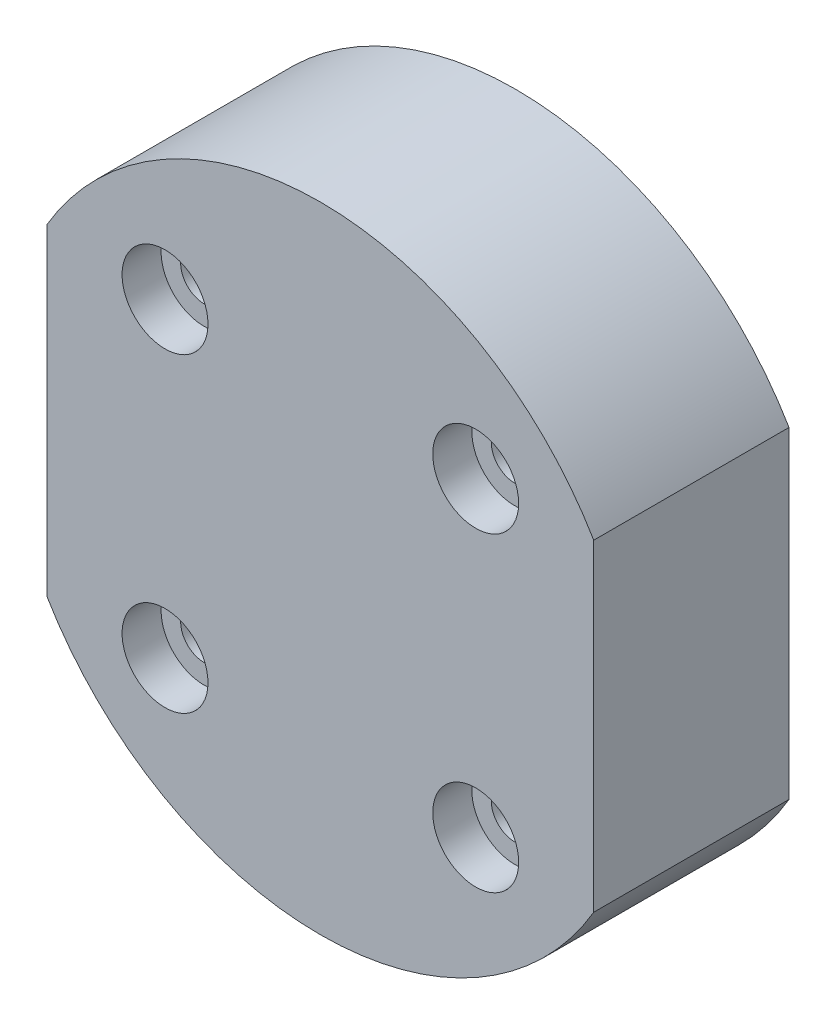
ISO-10303-21;
HEADER;
FILE_DESCRIPTION(('STEP AP214'),'2;1');
FILE_NAME('part.step','',(''),(''),'','','');
FILE_SCHEMA(('AUTOMOTIVE_DESIGN { 1 0 10303 214 1 1 1 1 }'));
ENDSEC;
DATA;
#1=APPLICATION_CONTEXT('core data for automotive mechanical design processes');
#2=APPLICATION_PROTOCOL_DEFINITION('international standard','automotive_design',2000,#1);
#3=PRODUCT_CONTEXT('',#1,'mechanical');
#4=PRODUCT('Part','Part','',(#3));
#5=PRODUCT_RELATED_PRODUCT_CATEGORY('part','',(#4));
#6=PRODUCT_DEFINITION_FORMATION('','',#4);
#7=PRODUCT_DEFINITION_CONTEXT('part definition',#1,'design');
#8=PRODUCT_DEFINITION('design','',#6,#7);
#9=PRODUCT_DEFINITION_SHAPE('','',#8);
#10=(LENGTH_UNIT() NAMED_UNIT(*) SI_UNIT(.MILLI.,.METRE.));
#11=(NAMED_UNIT(*) PLANE_ANGLE_UNIT() SI_UNIT($,.RADIAN.));
#12=(NAMED_UNIT(*) SI_UNIT($,.STERADIAN.) SOLID_ANGLE_UNIT());
#13=UNCERTAINTY_MEASURE_WITH_UNIT(LENGTH_MEASURE(1.E-05),#10,'distance_accuracy_value','');
#14=(GEOMETRIC_REPRESENTATION_CONTEXT(3) GLOBAL_UNCERTAINTY_ASSIGNED_CONTEXT((#13)) GLOBAL_UNIT_ASSIGNED_CONTEXT((#10,
#11,#12)) REPRESENTATION_CONTEXT('',''));
#15=CARTESIAN_POINT('',(0.,0.,0.));
#16=DIRECTION('',(0.,0.,1.));
#17=DIRECTION('',(1.,0.,0.));
#18=AXIS2_PLACEMENT_3D('',#15,#16,#17);
#19=CARTESIAN_POINT('',(0.,0.,-10.));
#20=DIRECTION('',(0.,0.,1.));
#21=DIRECTION('',(1.,0.,0.));
#22=AXIS2_PLACEMENT_3D('',#19,#20,#21);
#23=CYLINDRICAL_SURFACE('',#22,16.25);
#24=DIRECTION('',(0.,0.,1.));
#25=VECTOR('',#24,1.);
#26=CARTESIAN_POINT('',(14.,-8.25,-10.));
#27=LINE('',#26,#25);
#28=CARTESIAN_POINT('',(14.,-8.25,-10.));
#29=VERTEX_POINT('',#28);
#30=CARTESIAN_POINT('',(14.,-8.25,0.));
#31=VERTEX_POINT('',#30);
#32=EDGE_CURVE('E78',#29,#31,#27,.T.);
#33=ORIENTED_EDGE('',*,*,#32,.T.);
#34=CARTESIAN_POINT('',(0.,0.,0.));
#35=DIRECTION('',(0.,0.,1.));
#36=DIRECTION('',(1.,0.,0.));
#37=AXIS2_PLACEMENT_3D('',#34,#35,#36);
#38=CIRCLE('',#37,16.25);
#39=CARTESIAN_POINT('',(-14.,-8.25,0.));
#40=VERTEX_POINT('',#39);
#41=EDGE_CURVE('E100',#40,#31,#38,.T.);
#42=ORIENTED_EDGE('',*,*,#41,.F.);
#43=DIRECTION('',(0.,0.,1.));
#44=VECTOR('',#43,1.);
#45=CARTESIAN_POINT('',(-14.,-8.25,-10.));
#46=LINE('',#45,#44);
#47=CARTESIAN_POINT('',(-14.,-8.25,-10.));
#48=VERTEX_POINT('',#47);
#49=EDGE_CURVE('E52',#48,#40,#46,.T.);
#50=ORIENTED_EDGE('',*,*,#49,.F.);
#51=CARTESIAN_POINT('',(0.,0.,-10.));
#52=DIRECTION('',(0.,0.,1.));
#53=DIRECTION('',(1.,0.,0.));
#54=AXIS2_PLACEMENT_3D('',#51,#52,#53);
#55=CIRCLE('',#54,16.25);
#56=EDGE_CURVE('E95',#48,#29,#55,.T.);
#57=ORIENTED_EDGE('',*,*,#56,.T.);
#58=EDGE_LOOP('',(#33,#42,#50,#57));
#59=FACE_BOUND('',#58,.T.);
#60=ADVANCED_FACE('F37',(#59),#23,.T.);
#61=DIRECTION('',(0.,0.,1.));
#62=VECTOR('',#61,1.);
#63=CARTESIAN_POINT('',(14.,8.25,-10.));
#64=LINE('',#63,#62);
#65=CARTESIAN_POINT('',(14.,8.25,-10.));
#66=VERTEX_POINT('',#65);
#67=CARTESIAN_POINT('',(14.,8.25,0.));
#68=VERTEX_POINT('',#67);
#69=EDGE_CURVE('E59',#66,#68,#64,.T.);
#70=ORIENTED_EDGE('',*,*,#69,.F.);
#71=CARTESIAN_POINT('',(-14.,8.25,-10.));
#72=VERTEX_POINT('',#71);
#73=EDGE_CURVE('E89',#66,#72,#55,.T.);
#74=ORIENTED_EDGE('',*,*,#73,.T.);
#75=DIRECTION('',(0.,0.,1.));
#76=VECTOR('',#75,1.);
#77=CARTESIAN_POINT('',(-14.,8.25,-10.));
#78=LINE('',#77,#76);
#79=CARTESIAN_POINT('',(-14.,8.25,0.));
#80=VERTEX_POINT('',#79);
#81=EDGE_CURVE('E108',#72,#80,#78,.T.);
#82=ORIENTED_EDGE('',*,*,#81,.T.);
#83=EDGE_CURVE('E91',#68,#80,#38,.T.);
#84=ORIENTED_EDGE('',*,*,#83,.F.);
#85=EDGE_LOOP('',(#70,#74,#82,#84));
#86=FACE_BOUND('',#85,.T.);
#87=ADVANCED_FACE('F39',(#86),#23,.T.);
#88=CARTESIAN_POINT('',(0.,0.,-10.));
#89=DIRECTION('',(0.,0.,1.));
#90=DIRECTION('',(1.,0.,0.));
#91=AXIS2_PLACEMENT_3D('',#88,#89,#90);
#92=PLANE('',#91);
#93=CARTESIAN_POINT('',(7.95495128834866,7.95495128834866,-10.));
#94=DIRECTION('',(0.,0.,1.));
#95=DIRECTION('',(1.,0.,0.));
#96=AXIS2_PLACEMENT_3D('',#93,#94,#95);
#97=CIRCLE('',#96,1.2);
#98=CARTESIAN_POINT('',(9.15495128834866,7.95495128834866,-10.));
#99=VERTEX_POINT('',#98);
#100=EDGE_CURVE('E147',#99,#99,#97,.T.);
#101=ORIENTED_EDGE('',*,*,#100,.T.);
#102=EDGE_LOOP('',(#101));
#103=FACE_BOUND('',#102,.T.);
#104=CARTESIAN_POINT('',(7.95495128834866,-7.95495128834866,-10.));
#105=DIRECTION('',(0.,0.,1.));
#106=DIRECTION('',(1.,0.,0.));
#107=AXIS2_PLACEMENT_3D('',#104,#105,#106);
#108=CIRCLE('',#107,1.2);
#109=CARTESIAN_POINT('',(9.15495128834866,-7.95495128834866,-10.));
#110=VERTEX_POINT('',#109);
#111=EDGE_CURVE('E135',#110,#110,#108,.T.);
#112=ORIENTED_EDGE('',*,*,#111,.T.);
#113=EDGE_LOOP('',(#112));
#114=FACE_BOUND('',#113,.T.);
#115=CARTESIAN_POINT('',(-7.95495128834864,-7.95495128834868,-10.));
#116=DIRECTION('',(0.,0.,1.));
#117=DIRECTION('',(1.,0.,0.));
#118=AXIS2_PLACEMENT_3D('',#115,#116,#117);
#119=CIRCLE('',#118,1.2);
#120=CARTESIAN_POINT('',(-6.75495128834864,-7.95495128834868,-10.));
#121=VERTEX_POINT('',#120);
#122=EDGE_CURVE('E123',#121,#121,#119,.T.);
#123=ORIENTED_EDGE('',*,*,#122,.T.);
#124=EDGE_LOOP('',(#123));
#125=FACE_BOUND('',#124,.T.);
#126=CARTESIAN_POINT('',(-7.95495128834867,7.95495128834865,-10.));
#127=DIRECTION('',(0.,0.,1.));
#128=DIRECTION('',(1.,0.,0.));
#129=AXIS2_PLACEMENT_3D('',#126,#127,#128);
#130=CIRCLE('',#129,1.2);
#131=CARTESIAN_POINT('',(-6.75495128834867,7.95495128834865,-10.));
#132=VERTEX_POINT('',#131);
#133=EDGE_CURVE('E109',#132,#132,#130,.T.);
#134=ORIENTED_EDGE('',*,*,#133,.T.);
#135=EDGE_LOOP('',(#134));
#136=FACE_BOUND('',#135,.T.);
#137=ORIENTED_EDGE('',*,*,#73,.F.);
#138=DIRECTION('',(0.,-1.,0.));
#139=VECTOR('',#138,1.);
#140=CARTESIAN_POINT('',(14.,8.25,-10.));
#141=LINE('',#140,#139);
#142=EDGE_CURVE('E75',#66,#29,#141,.T.);
#143=ORIENTED_EDGE('',*,*,#142,.T.);
#144=ORIENTED_EDGE('',*,*,#56,.F.);
#145=DIRECTION('',(0.,1.,0.));
#146=VECTOR('',#145,1.);
#147=CARTESIAN_POINT('',(-14.,8.25,-10.));
#148=LINE('',#147,#146);
#149=EDGE_CURVE('E83',#48,#72,#148,.T.);
#150=ORIENTED_EDGE('',*,*,#149,.T.);
#151=EDGE_LOOP('',(#137,#143,#144,#150));
#152=FACE_BOUND('',#151,.T.);
#153=ADVANCED_FACE('F94',(#103,#114,#125,#136,#152),#92,.F.);
#154=CARTESIAN_POINT('',(0.,0.,0.));
#155=DIRECTION('',(0.,0.,1.));
#156=DIRECTION('',(1.,0.,0.));
#157=AXIS2_PLACEMENT_3D('',#154,#155,#156);
#158=PLANE('',#157);
#159=CARTESIAN_POINT('',(7.95495128834866,7.95495128834866,0.));
#160=DIRECTION('',(0.,0.,1.));
#161=DIRECTION('',(1.,0.,0.));
#162=AXIS2_PLACEMENT_3D('',#159,#160,#161);
#163=CIRCLE('',#162,2.19999999999999);
#164=CARTESIAN_POINT('',(10.1549512883487,7.95495128834866,0.));
#165=VERTEX_POINT('',#164);
#166=EDGE_CURVE('E156',#165,#165,#163,.T.);
#167=ORIENTED_EDGE('',*,*,#166,.F.);
#168=EDGE_LOOP('',(#167));
#169=FACE_BOUND('',#168,.T.);
#170=CARTESIAN_POINT('',(7.95495128834866,-7.95495128834866,0.));
#171=DIRECTION('',(0.,0.,1.));
#172=DIRECTION('',(1.,0.,0.));
#173=AXIS2_PLACEMENT_3D('',#170,#171,#172);
#174=CIRCLE('',#173,2.19999999999999);
#175=CARTESIAN_POINT('',(10.1549512883487,-7.95495128834866,0.));
#176=VERTEX_POINT('',#175);
#177=EDGE_CURVE('E144',#176,#176,#174,.T.);
#178=ORIENTED_EDGE('',*,*,#177,.F.);
#179=EDGE_LOOP('',(#178));
#180=FACE_BOUND('',#179,.T.);
#181=CARTESIAN_POINT('',(-7.95495128834864,-7.95495128834868,0.));
#182=DIRECTION('',(0.,0.,1.));
#183=DIRECTION('',(1.,0.,0.));
#184=AXIS2_PLACEMENT_3D('',#181,#182,#183);
#185=CIRCLE('',#184,2.19999999999999);
#186=CARTESIAN_POINT('',(-5.75495128834865,-7.95495128834868,0.));
#187=VERTEX_POINT('',#186);
#188=EDGE_CURVE('E132',#187,#187,#185,.T.);
#189=ORIENTED_EDGE('',*,*,#188,.F.);
#190=EDGE_LOOP('',(#189));
#191=FACE_BOUND('',#190,.T.);
#192=CARTESIAN_POINT('',(-7.95495128834867,7.95495128834865,0.));
#193=DIRECTION('',(0.,0.,1.));
#194=DIRECTION('',(1.,0.,0.));
#195=AXIS2_PLACEMENT_3D('',#192,#193,#194);
#196=CIRCLE('',#195,2.19999999999999);
#197=CARTESIAN_POINT('',(-5.75495128834868,7.95495128834865,0.));
#198=VERTEX_POINT('',#197);
#199=EDGE_CURVE('E120',#198,#198,#196,.T.);
#200=ORIENTED_EDGE('',*,*,#199,.F.);
#201=EDGE_LOOP('',(#200));
#202=FACE_BOUND('',#201,.T.);
#203=DIRECTION('',(0.,-1.,0.));
#204=VECTOR('',#203,1.);
#205=CARTESIAN_POINT('',(14.,0.,0.));
#206=LINE('',#205,#204);
#207=EDGE_CURVE('E11',#68,#31,#206,.T.);
#208=ORIENTED_EDGE('',*,*,#207,.F.);
#209=ORIENTED_EDGE('',*,*,#83,.T.);
#210=DIRECTION('',(0.,1.,0.));
#211=VECTOR('',#210,1.);
#212=CARTESIAN_POINT('',(-14.,0.,0.));
#213=LINE('',#212,#211);
#214=EDGE_CURVE('E45',#40,#80,#213,.T.);
#215=ORIENTED_EDGE('',*,*,#214,.F.);
#216=ORIENTED_EDGE('',*,*,#41,.T.);
#217=EDGE_LOOP('',(#208,#209,#215,#216));
#218=FACE_BOUND('',#217,.T.);
#219=ADVANCED_FACE('F162',(#169,#180,#191,#202,#218),#158,.T.);
#220=CARTESIAN_POINT('',(-14.,8.25,-10.));
#221=DIRECTION('',(1.,0.,0.));
#222=DIRECTION('',(0.,0.,-1.));
#223=AXIS2_PLACEMENT_3D('',#220,#221,#222);
#224=PLANE('',#223);
#225=ORIENTED_EDGE('',*,*,#214,.T.);
#226=ORIENTED_EDGE('',*,*,#81,.F.);
#227=ORIENTED_EDGE('',*,*,#149,.F.);
#228=ORIENTED_EDGE('',*,*,#49,.T.);
#229=EDGE_LOOP('',(#225,#226,#227,#228));
#230=FACE_BOUND('',#229,.T.);
#231=ADVANCED_FACE('F165',(#230),#224,.F.);
#232=CARTESIAN_POINT('',(14.,8.25,-10.));
#233=DIRECTION('',(-1.,0.,0.));
#234=DIRECTION('',(0.,0.,1.));
#235=AXIS2_PLACEMENT_3D('',#232,#233,#234);
#236=PLANE('',#235);
#237=ORIENTED_EDGE('',*,*,#207,.T.);
#238=ORIENTED_EDGE('',*,*,#32,.F.);
#239=ORIENTED_EDGE('',*,*,#142,.F.);
#240=ORIENTED_EDGE('',*,*,#69,.T.);
#241=EDGE_LOOP('',(#237,#238,#239,#240));
#242=FACE_BOUND('',#241,.T.);
#243=ADVANCED_FACE('F76',(#242),#236,.F.);
#244=CARTESIAN_POINT('',(-7.95495128834867,7.95495128834865,0.));
#245=DIRECTION('',(0.,0.,1.));
#246=DIRECTION('',(1.,0.,0.));
#247=AXIS2_PLACEMENT_3D('',#244,#245,#246);
#248=CYLINDRICAL_SURFACE('',#247,1.2);
#249=ORIENTED_EDGE('',*,*,#133,.F.);
#250=EDGE_LOOP('',(#249));
#251=FACE_BOUND('',#250,.T.);
#252=CARTESIAN_POINT('',(-7.95495128834867,7.95495128834865,-2.));
#253=DIRECTION('',(0.,0.,1.));
#254=DIRECTION('',(1.,0.,0.));
#255=AXIS2_PLACEMENT_3D('',#252,#253,#254);
#256=CIRCLE('',#255,1.2);
#257=CARTESIAN_POINT('',(-6.75495128834867,7.95495128834865,-2.));
#258=VERTEX_POINT('',#257);
#259=EDGE_CURVE('E111',#258,#258,#256,.T.);
#260=ORIENTED_EDGE('',*,*,#259,.T.);
#261=EDGE_LOOP('',(#260));
#262=FACE_BOUND('',#261,.T.);
#263=ADVANCED_FACE('F185',(#251,#262),#248,.F.);
#264=CARTESIAN_POINT('',(-6.75495128834867,7.95495128834865,-2.));
#265=DIRECTION('',(0.,0.,-1.));
#266=DIRECTION('',(-1.,0.,0.));
#267=AXIS2_PLACEMENT_3D('',#264,#265,#266);
#268=PLANE('',#267);
#269=ORIENTED_EDGE('',*,*,#259,.F.);
#270=EDGE_LOOP('',(#269));
#271=FACE_BOUND('',#270,.T.);
#272=CARTESIAN_POINT('',(-7.95495128834867,7.95495128834865,-2.));
#273=DIRECTION('',(0.,0.,1.));
#274=DIRECTION('',(1.,0.,0.));
#275=AXIS2_PLACEMENT_3D('',#272,#273,#274);
#276=CIRCLE('',#275,2.2);
#277=CARTESIAN_POINT('',(-5.75495128834868,7.95495128834865,-2.));
#278=VERTEX_POINT('',#277);
#279=EDGE_CURVE('E115',#278,#278,#276,.T.);
#280=ORIENTED_EDGE('',*,*,#279,.T.);
#281=EDGE_LOOP('',(#280));
#282=FACE_BOUND('',#281,.T.);
#283=ADVANCED_FACE('F175',(#271,#282),#268,.F.);
#284=CARTESIAN_POINT('',(-7.95495128834867,7.95495128834865,0.));
#285=DIRECTION('',(0.,0.,1.));
#286=DIRECTION('',(1.,0.,0.));
#287=AXIS2_PLACEMENT_3D('',#284,#285,#286);
#288=CYLINDRICAL_SURFACE('',#287,2.19999999999999);
#289=ORIENTED_EDGE('',*,*,#279,.F.);
#290=EDGE_LOOP('',(#289));
#291=FACE_BOUND('',#290,.T.);
#292=ORIENTED_EDGE('',*,*,#199,.T.);
#293=EDGE_LOOP('',(#292));
#294=FACE_BOUND('',#293,.T.);
#295=ADVANCED_FACE('F172',(#291,#294),#288,.F.);
#296=CARTESIAN_POINT('',(-7.95495128834864,-7.95495128834868,0.));
#297=DIRECTION('',(0.,0.,1.));
#298=DIRECTION('',(1.,0.,0.));
#299=AXIS2_PLACEMENT_3D('',#296,#297,#298);
#300=CYLINDRICAL_SURFACE('',#299,1.2);
#301=ORIENTED_EDGE('',*,*,#122,.F.);
#302=EDGE_LOOP('',(#301));
#303=FACE_BOUND('',#302,.T.);
#304=CARTESIAN_POINT('',(-7.95495128834864,-7.95495128834868,-2.));
#305=DIRECTION('',(0.,0.,1.));
#306=DIRECTION('',(1.,0.,0.));
#307=AXIS2_PLACEMENT_3D('',#304,#305,#306);
#308=CIRCLE('',#307,1.2);
#309=CARTESIAN_POINT('',(-6.75495128834864,-7.95495128834868,-2.));
#310=VERTEX_POINT('',#309);
#311=EDGE_CURVE('E126',#310,#310,#308,.T.);
#312=ORIENTED_EDGE('',*,*,#311,.T.);
#313=EDGE_LOOP('',(#312));
#314=FACE_BOUND('',#313,.T.);
#315=ADVANCED_FACE('F174',(#303,#314),#300,.F.);
#316=CARTESIAN_POINT('',(-6.75495128834864,-7.95495128834868,-2.));
#317=DIRECTION('',(0.,0.,-1.));
#318=DIRECTION('',(-1.,0.,0.));
#319=AXIS2_PLACEMENT_3D('',#316,#317,#318);
#320=PLANE('',#319);
#321=ORIENTED_EDGE('',*,*,#311,.F.);
#322=EDGE_LOOP('',(#321));
#323=FACE_BOUND('',#322,.T.);
#324=CARTESIAN_POINT('',(-7.95495128834864,-7.95495128834868,-2.));
#325=DIRECTION('',(0.,0.,1.));
#326=DIRECTION('',(1.,0.,0.));
#327=AXIS2_PLACEMENT_3D('',#324,#325,#326);
#328=CIRCLE('',#327,2.2);
#329=CARTESIAN_POINT('',(-5.75495128834865,-7.95495128834868,-2.));
#330=VERTEX_POINT('',#329);
#331=EDGE_CURVE('E129',#330,#330,#328,.T.);
#332=ORIENTED_EDGE('',*,*,#331,.T.);
#333=EDGE_LOOP('',(#332));
#334=FACE_BOUND('',#333,.T.);
#335=ADVANCED_FACE('F182',(#323,#334),#320,.F.);
#336=CARTESIAN_POINT('',(-7.95495128834864,-7.95495128834868,0.));
#337=DIRECTION('',(0.,0.,1.));
#338=DIRECTION('',(1.,0.,0.));
#339=AXIS2_PLACEMENT_3D('',#336,#337,#338);
#340=CYLINDRICAL_SURFACE('',#339,2.19999999999999);
#341=ORIENTED_EDGE('',*,*,#331,.F.);
#342=EDGE_LOOP('',(#341));
#343=FACE_BOUND('',#342,.T.);
#344=ORIENTED_EDGE('',*,*,#188,.T.);
#345=EDGE_LOOP('',(#344));
#346=FACE_BOUND('',#345,.T.);
#347=ADVANCED_FACE('F242',(#343,#346),#340,.F.);
#348=CARTESIAN_POINT('',(7.95495128834866,-7.95495128834866,0.));
#349=DIRECTION('',(0.,0.,1.));
#350=DIRECTION('',(1.,0.,0.));
#351=AXIS2_PLACEMENT_3D('',#348,#349,#350);
#352=CYLINDRICAL_SURFACE('',#351,1.2);
#353=ORIENTED_EDGE('',*,*,#111,.F.);
#354=EDGE_LOOP('',(#353));
#355=FACE_BOUND('',#354,.T.);
#356=CARTESIAN_POINT('',(7.95495128834866,-7.95495128834866,-2.));
#357=DIRECTION('',(0.,0.,1.));
#358=DIRECTION('',(1.,0.,0.));
#359=AXIS2_PLACEMENT_3D('',#356,#357,#358);
#360=CIRCLE('',#359,1.2);
#361=CARTESIAN_POINT('',(9.15495128834866,-7.95495128834866,-2.));
#362=VERTEX_POINT('',#361);
#363=EDGE_CURVE('E138',#362,#362,#360,.T.);
#364=ORIENTED_EDGE('',*,*,#363,.T.);
#365=EDGE_LOOP('',(#364));
#366=FACE_BOUND('',#365,.T.);
#367=ADVANCED_FACE('F253',(#355,#366),#352,.F.);
#368=CARTESIAN_POINT('',(9.15495128834866,-7.95495128834866,-2.));
#369=DIRECTION('',(0.,0.,-1.));
#370=DIRECTION('',(-1.,0.,0.));
#371=AXIS2_PLACEMENT_3D('',#368,#369,#370);
#372=PLANE('',#371);
#373=ORIENTED_EDGE('',*,*,#363,.F.);
#374=EDGE_LOOP('',(#373));
#375=FACE_BOUND('',#374,.T.);
#376=CARTESIAN_POINT('',(7.95495128834866,-7.95495128834866,-2.));
#377=DIRECTION('',(0.,0.,1.));
#378=DIRECTION('',(1.,0.,0.));
#379=AXIS2_PLACEMENT_3D('',#376,#377,#378);
#380=CIRCLE('',#379,2.2);
#381=CARTESIAN_POINT('',(10.1549512883487,-7.95495128834866,-2.));
#382=VERTEX_POINT('',#381);
#383=EDGE_CURVE('E141',#382,#382,#380,.T.);
#384=ORIENTED_EDGE('',*,*,#383,.T.);
#385=EDGE_LOOP('',(#384));
#386=FACE_BOUND('',#385,.T.);
#387=ADVANCED_FACE('F264',(#375,#386),#372,.F.);
#388=CARTESIAN_POINT('',(7.95495128834866,-7.95495128834866,0.));
#389=DIRECTION('',(0.,0.,1.));
#390=DIRECTION('',(1.,0.,0.));
#391=AXIS2_PLACEMENT_3D('',#388,#389,#390);
#392=CYLINDRICAL_SURFACE('',#391,2.2);
#393=ORIENTED_EDGE('',*,*,#383,.F.);
#394=EDGE_LOOP('',(#393));
#395=FACE_BOUND('',#394,.T.);
#396=ORIENTED_EDGE('',*,*,#177,.T.);
#397=EDGE_LOOP('',(#396));
#398=FACE_BOUND('',#397,.T.);
#399=ADVANCED_FACE('F275',(#395,#398),#392,.F.);
#400=CARTESIAN_POINT('',(7.95495128834866,7.95495128834866,0.));
#401=DIRECTION('',(0.,0.,1.));
#402=DIRECTION('',(1.,0.,0.));
#403=AXIS2_PLACEMENT_3D('',#400,#401,#402);
#404=CYLINDRICAL_SURFACE('',#403,1.2);
#405=ORIENTED_EDGE('',*,*,#100,.F.);
#406=EDGE_LOOP('',(#405));
#407=FACE_BOUND('',#406,.T.);
#408=CARTESIAN_POINT('',(7.95495128834866,7.95495128834866,-2.));
#409=DIRECTION('',(0.,0.,1.));
#410=DIRECTION('',(1.,0.,0.));
#411=AXIS2_PLACEMENT_3D('',#408,#409,#410);
#412=CIRCLE('',#411,1.2);
#413=CARTESIAN_POINT('',(9.15495128834866,7.95495128834866,-2.));
#414=VERTEX_POINT('',#413);
#415=EDGE_CURVE('E150',#414,#414,#412,.T.);
#416=ORIENTED_EDGE('',*,*,#415,.T.);
#417=EDGE_LOOP('',(#416));
#418=FACE_BOUND('',#417,.T.);
#419=ADVANCED_FACE('F286',(#407,#418),#404,.F.);
#420=CARTESIAN_POINT('',(9.15495128834866,7.95495128834866,-2.));
#421=DIRECTION('',(0.,0.,-1.));
#422=DIRECTION('',(-1.,0.,0.));
#423=AXIS2_PLACEMENT_3D('',#420,#421,#422);
#424=PLANE('',#423);
#425=ORIENTED_EDGE('',*,*,#415,.F.);
#426=EDGE_LOOP('',(#425));
#427=FACE_BOUND('',#426,.T.);
#428=CARTESIAN_POINT('',(7.95495128834866,7.95495128834866,-2.));
#429=DIRECTION('',(0.,0.,1.));
#430=DIRECTION('',(1.,0.,0.));
#431=AXIS2_PLACEMENT_3D('',#428,#429,#430);
#432=CIRCLE('',#431,2.2);
#433=CARTESIAN_POINT('',(10.1549512883487,7.95495128834866,-2.));
#434=VERTEX_POINT('',#433);
#435=EDGE_CURVE('E153',#434,#434,#432,.T.);
#436=ORIENTED_EDGE('',*,*,#435,.T.);
#437=EDGE_LOOP('',(#436));
#438=FACE_BOUND('',#437,.T.);
#439=ADVANCED_FACE('F297',(#427,#438),#424,.F.);
#440=CARTESIAN_POINT('',(7.95495128834866,7.95495128834866,0.));
#441=DIRECTION('',(0.,0.,1.));
#442=DIRECTION('',(1.,0.,0.));
#443=AXIS2_PLACEMENT_3D('',#440,#441,#442);
#444=CYLINDRICAL_SURFACE('',#443,2.19999999999999);
#445=ORIENTED_EDGE('',*,*,#435,.F.);
#446=EDGE_LOOP('',(#445));
#447=FACE_BOUND('',#446,.T.);
#448=ORIENTED_EDGE('',*,*,#166,.T.);
#449=EDGE_LOOP('',(#448));
#450=FACE_BOUND('',#449,.T.);
#451=ADVANCED_FACE('F160',(#447,#450),#444,.F.);
#452=CLOSED_SHELL('',(#60,#87,#153,#219,#231,#243,#263,#283,#295,#315,#335,#347,#367,#387,#399,
#419,#439,#451));
#453=MANIFOLD_SOLID_BREP('B2',#452);
#454=ADVANCED_BREP_SHAPE_REPRESENTATION('',(#18,#453),#14);
#455=SHAPE_DEFINITION_REPRESENTATION(#9,#454);
ENDSEC;
END-ISO-10303-21;
